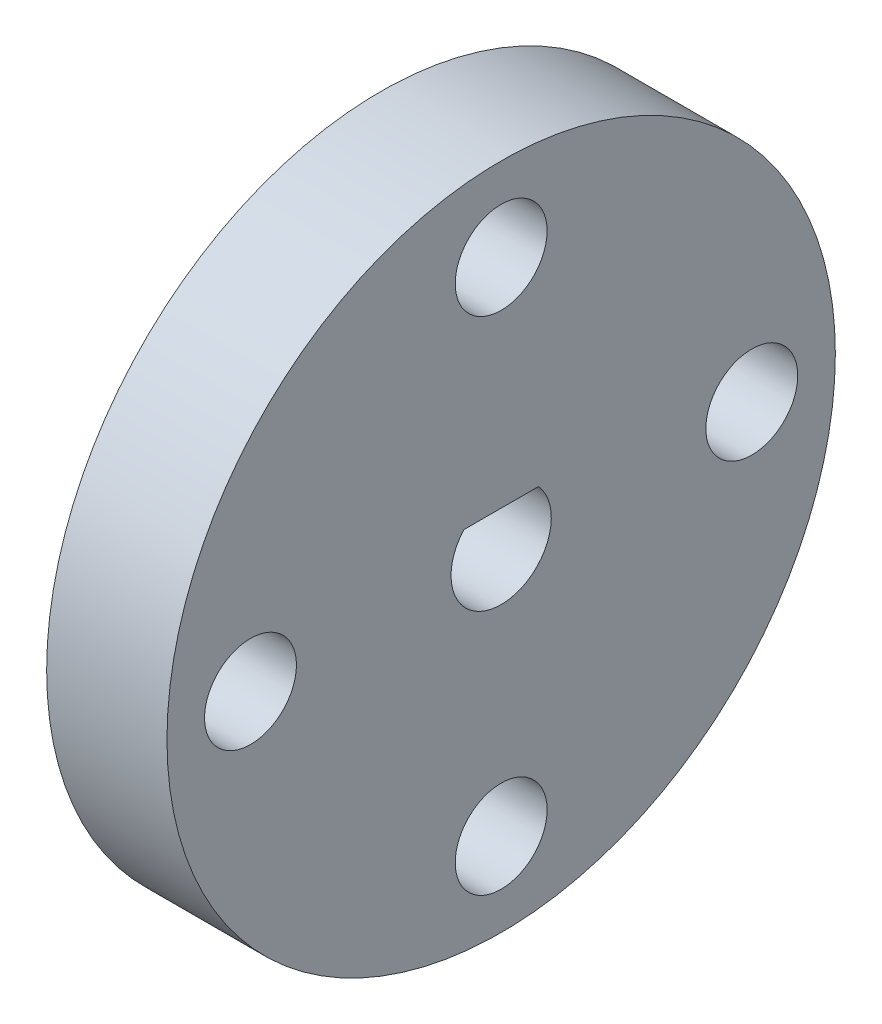
ISO-10303-21;
HEADER;
FILE_DESCRIPTION(('STEP AP214'),'2;1');
FILE_NAME('part.step','',(''),(''),'','','');
FILE_SCHEMA(('AUTOMOTIVE_DESIGN { 1 0 10303 214 1 1 1 1 }'));
ENDSEC;
DATA;
#1=APPLICATION_CONTEXT('core data for automotive mechanical design processes');
#2=APPLICATION_PROTOCOL_DEFINITION('international standard','automotive_design',2000,#1);
#3=PRODUCT_CONTEXT('',#1,'mechanical');
#4=PRODUCT('Part','Part','',(#3));
#5=PRODUCT_RELATED_PRODUCT_CATEGORY('part','',(#4));
#6=PRODUCT_DEFINITION_FORMATION('','',#4);
#7=PRODUCT_DEFINITION_CONTEXT('part definition',#1,'design');
#8=PRODUCT_DEFINITION('design','',#6,#7);
#9=PRODUCT_DEFINITION_SHAPE('','',#8);
#10=(LENGTH_UNIT() NAMED_UNIT(*) SI_UNIT(.MILLI.,.METRE.));
#11=(NAMED_UNIT(*) PLANE_ANGLE_UNIT() SI_UNIT($,.RADIAN.));
#12=(NAMED_UNIT(*) SI_UNIT($,.STERADIAN.) SOLID_ANGLE_UNIT());
#13=UNCERTAINTY_MEASURE_WITH_UNIT(LENGTH_MEASURE(1.E-05),#10,'distance_accuracy_value','');
#14=(GEOMETRIC_REPRESENTATION_CONTEXT(3) GLOBAL_UNCERTAINTY_ASSIGNED_CONTEXT((#13)) GLOBAL_UNIT_ASSIGNED_CONTEXT((#10,
#11,#12)) REPRESENTATION_CONTEXT('',''));
#15=CARTESIAN_POINT('',(0.,0.,0.));
#16=DIRECTION('',(0.,0.,1.));
#17=DIRECTION('',(1.,0.,0.));
#18=AXIS2_PLACEMENT_3D('',#15,#16,#17);
#19=CARTESIAN_POINT('',(7.2,0.,0.));
#20=DIRECTION('',(-1.,0.,0.));
#21=DIRECTION('',(0.,0.,1.));
#22=AXIS2_PLACEMENT_3D('',#19,#20,#21);
#23=PLANE('',#22);
#24=CARTESIAN_POINT('',(7.2,15.,0.));
#25=DIRECTION('',(1.,0.,0.));
#26=DIRECTION('',(0.,0.,-1.));
#27=AXIS2_PLACEMENT_3D('',#24,#25,#26);
#28=CIRCLE('',#27,2.74999999999999);
#29=CARTESIAN_POINT('',(7.2,15.,-2.74999999999999));
#30=VERTEX_POINT('',#29);
#31=EDGE_CURVE('E100',#30,#30,#28,.T.);
#32=ORIENTED_EDGE('',*,*,#31,.F.);
#33=EDGE_LOOP('',(#32));
#34=FACE_BOUND('',#33,.T.);
#35=CARTESIAN_POINT('',(7.2,0.,-15.));
#36=DIRECTION('',(1.,0.,0.));
#37=DIRECTION('',(0.,0.,-1.));
#38=AXIS2_PLACEMENT_3D('',#35,#36,#37);
#39=CIRCLE('',#38,2.74999999999999);
#40=CARTESIAN_POINT('',(7.2,0.,-17.75));
#41=VERTEX_POINT('',#40);
#42=EDGE_CURVE('E104',#41,#41,#39,.T.);
#43=ORIENTED_EDGE('',*,*,#42,.F.);
#44=EDGE_LOOP('',(#43));
#45=FACE_BOUND('',#44,.T.);
#46=CARTESIAN_POINT('',(7.2,-15.,0.));
#47=DIRECTION('',(1.,0.,0.));
#48=DIRECTION('',(0.,0.,-1.));
#49=AXIS2_PLACEMENT_3D('',#46,#47,#48);
#50=CIRCLE('',#49,2.74999999999999);
#51=CARTESIAN_POINT('',(7.2,-15.,-2.74999999999999));
#52=VERTEX_POINT('',#51);
#53=EDGE_CURVE('E108',#52,#52,#50,.T.);
#54=ORIENTED_EDGE('',*,*,#53,.F.);
#55=EDGE_LOOP('',(#54));
#56=FACE_BOUND('',#55,.T.);
#57=CARTESIAN_POINT('',(7.2,0.,15.));
#58=DIRECTION('',(1.,0.,0.));
#59=DIRECTION('',(0.,0.,-1.));
#60=AXIS2_PLACEMENT_3D('',#57,#58,#59);
#61=CIRCLE('',#60,2.74999999999999);
#62=CARTESIAN_POINT('',(7.2,0.,12.25));
#63=VERTEX_POINT('',#62);
#64=EDGE_CURVE('E78',#63,#63,#61,.T.);
#65=ORIENTED_EDGE('',*,*,#64,.F.);
#66=EDGE_LOOP('',(#65));
#67=FACE_BOUND('',#66,.T.);
#68=DIRECTION('',(0.,0.,1.));
#69=VECTOR('',#68,1.);
#70=CARTESIAN_POINT('',(7.2,2.,2.23606797749979));
#71=LINE('',#70,#69);
#72=CARTESIAN_POINT('',(7.2,2.,-2.23606797749979));
#73=VERTEX_POINT('',#72);
#74=CARTESIAN_POINT('',(7.2,2.,2.23606797749979));
#75=VERTEX_POINT('',#74);
#76=EDGE_CURVE('E70',#73,#75,#71,.T.);
#77=ORIENTED_EDGE('',*,*,#76,.F.);
#78=CARTESIAN_POINT('',(7.2,0.,0.));
#79=DIRECTION('',(1.,0.,0.));
#80=DIRECTION('',(0.,0.,-1.));
#81=AXIS2_PLACEMENT_3D('',#78,#79,#80);
#82=CIRCLE('',#81,3.);
#83=EDGE_CURVE('E51',#75,#73,#82,.T.);
#84=ORIENTED_EDGE('',*,*,#83,.F.);
#85=EDGE_LOOP('',(#77,#84));
#86=FACE_BOUND('',#85,.T.);
#87=CARTESIAN_POINT('',(7.2,0.,0.));
#88=DIRECTION('',(-1.,0.,0.));
#89=DIRECTION('',(0.,0.,1.));
#90=AXIS2_PLACEMENT_3D('',#87,#88,#89);
#91=CIRCLE('',#90,20.);
#92=CARTESIAN_POINT('',(7.2,0.,20.));
#93=VERTEX_POINT('',#92);
#94=EDGE_CURVE('E11',#93,#93,#91,.T.);
#95=ORIENTED_EDGE('',*,*,#94,.F.);
#96=EDGE_LOOP('',(#95));
#97=FACE_BOUND('',#96,.T.);
#98=ADVANCED_FACE('F37',(#34,#45,#56,#67,#86,#97),#23,.F.);
#99=CARTESIAN_POINT('',(-35.,0.,0.));
#100=DIRECTION('',(-1.,0.,0.));
#101=DIRECTION('',(0.,0.,1.));
#102=AXIS2_PLACEMENT_3D('',#99,#100,#101);
#103=CYLINDRICAL_SURFACE('',#102,20.);
#104=CARTESIAN_POINT('',(0.,0.,0.));
#105=DIRECTION('',(-1.,0.,0.));
#106=DIRECTION('',(0.,0.,1.));
#107=AXIS2_PLACEMENT_3D('',#104,#105,#106);
#108=CIRCLE('',#107,20.);
#109=CARTESIAN_POINT('',(0.,0.,20.));
#110=VERTEX_POINT('',#109);
#111=EDGE_CURVE('E44',#110,#110,#108,.T.);
#112=ORIENTED_EDGE('',*,*,#111,.F.);
#113=EDGE_LOOP('',(#112));
#114=FACE_BOUND('',#113,.T.);
#115=ORIENTED_EDGE('',*,*,#94,.T.);
#116=EDGE_LOOP('',(#115));
#117=FACE_BOUND('',#116,.T.);
#118=ADVANCED_FACE('F89',(#114,#117),#103,.T.);
#119=CARTESIAN_POINT('',(0.,0.,0.));
#120=DIRECTION('',(1.,0.,0.));
#121=DIRECTION('',(0.,0.,-1.));
#122=AXIS2_PLACEMENT_3D('',#119,#120,#121);
#123=PLANE('',#122);
#124=CARTESIAN_POINT('',(0.,15.,0.));
#125=DIRECTION('',(1.,0.,0.));
#126=DIRECTION('',(0.,0.,-1.));
#127=AXIS2_PLACEMENT_3D('',#124,#125,#126);
#128=CIRCLE('',#127,2.75);
#129=CARTESIAN_POINT('',(0.,15.,-2.75));
#130=VERTEX_POINT('',#129);
#131=EDGE_CURVE('E149',#130,#130,#128,.T.);
#132=ORIENTED_EDGE('',*,*,#131,.T.);
#133=EDGE_LOOP('',(#132));
#134=FACE_BOUND('',#133,.T.);
#135=CARTESIAN_POINT('',(0.,0.,-15.));
#136=DIRECTION('',(1.,0.,0.));
#137=DIRECTION('',(0.,0.,-1.));
#138=AXIS2_PLACEMENT_3D('',#135,#136,#137);
#139=CIRCLE('',#138,2.75);
#140=CARTESIAN_POINT('',(0.,0.,-17.75));
#141=VERTEX_POINT('',#140);
#142=EDGE_CURVE('E154',#141,#141,#139,.T.);
#143=ORIENTED_EDGE('',*,*,#142,.T.);
#144=EDGE_LOOP('',(#143));
#145=FACE_BOUND('',#144,.T.);
#146=CARTESIAN_POINT('',(0.,-15.,0.));
#147=DIRECTION('',(1.,0.,0.));
#148=DIRECTION('',(0.,0.,-1.));
#149=AXIS2_PLACEMENT_3D('',#146,#147,#148);
#150=CIRCLE('',#149,2.75);
#151=CARTESIAN_POINT('',(0.,-15.,-2.75));
#152=VERTEX_POINT('',#151);
#153=EDGE_CURVE('E112',#152,#152,#150,.T.);
#154=ORIENTED_EDGE('',*,*,#153,.T.);
#155=EDGE_LOOP('',(#154));
#156=FACE_BOUND('',#155,.T.);
#157=CARTESIAN_POINT('',(0.,0.,15.));
#158=DIRECTION('',(1.,0.,0.));
#159=DIRECTION('',(0.,0.,-1.));
#160=AXIS2_PLACEMENT_3D('',#157,#158,#159);
#161=CIRCLE('',#160,2.75);
#162=CARTESIAN_POINT('',(0.,0.,12.25));
#163=VERTEX_POINT('',#162);
#164=EDGE_CURVE('E75',#163,#163,#161,.T.);
#165=ORIENTED_EDGE('',*,*,#164,.T.);
#166=EDGE_LOOP('',(#165));
#167=FACE_BOUND('',#166,.T.);
#168=DIRECTION('',(0.,0.,1.));
#169=VECTOR('',#168,1.);
#170=CARTESIAN_POINT('',(0.,2.,2.23606797749979));
#171=LINE('',#170,#169);
#172=CARTESIAN_POINT('',(0.,2.,-2.23606797749979));
#173=VERTEX_POINT('',#172);
#174=CARTESIAN_POINT('',(0.,2.,2.23606797749979));
#175=VERTEX_POINT('',#174);
#176=EDGE_CURVE('E81',#173,#175,#171,.T.);
#177=ORIENTED_EDGE('',*,*,#176,.T.);
#178=CARTESIAN_POINT('',(0.,0.,0.));
#179=DIRECTION('',(1.,0.,0.));
#180=DIRECTION('',(0.,0.,-1.));
#181=AXIS2_PLACEMENT_3D('',#178,#179,#180);
#182=CIRCLE('',#181,3.);
#183=EDGE_CURVE('E56',#175,#173,#182,.T.);
#184=ORIENTED_EDGE('',*,*,#183,.T.);
#185=EDGE_LOOP('',(#177,#184));
#186=FACE_BOUND('',#185,.T.);
#187=ORIENTED_EDGE('',*,*,#111,.T.);
#188=EDGE_LOOP('',(#187));
#189=FACE_BOUND('',#188,.T.);
#190=ADVANCED_FACE('F87',(#134,#145,#156,#167,#186,#189),#123,.F.);
#191=CARTESIAN_POINT('',(0.,0.,0.));
#192=DIRECTION('',(1.,0.,0.));
#193=DIRECTION('',(0.,0.,-1.));
#194=AXIS2_PLACEMENT_3D('',#191,#192,#193);
#195=CYLINDRICAL_SURFACE('',#194,3.);
#196=ORIENTED_EDGE('',*,*,#83,.T.);
#197=DIRECTION('',(1.,0.,0.));
#198=VECTOR('',#197,1.);
#199=CARTESIAN_POINT('',(0.,2.,-2.23606797749979));
#200=LINE('',#199,#198);
#201=EDGE_CURVE('E67',#173,#73,#200,.T.);
#202=ORIENTED_EDGE('',*,*,#201,.F.);
#203=ORIENTED_EDGE('',*,*,#183,.F.);
#204=DIRECTION('',(1.,0.,0.));
#205=VECTOR('',#204,1.);
#206=CARTESIAN_POINT('',(0.,2.,2.23606797749979));
#207=LINE('',#206,#205);
#208=EDGE_CURVE('E61',#175,#75,#207,.T.);
#209=ORIENTED_EDGE('',*,*,#208,.T.);
#210=EDGE_LOOP('',(#196,#202,#203,#209));
#211=FACE_BOUND('',#210,.T.);
#212=ADVANCED_FACE('F63',(#211),#195,.F.);
#213=CARTESIAN_POINT('',(0.,2.,2.23606797749979));
#214=DIRECTION('',(0.,1.,0.));
#215=DIRECTION('',(0.,0.,1.));
#216=AXIS2_PLACEMENT_3D('',#213,#214,#215);
#217=PLANE('',#216);
#218=ORIENTED_EDGE('',*,*,#76,.T.);
#219=ORIENTED_EDGE('',*,*,#208,.F.);
#220=ORIENTED_EDGE('',*,*,#176,.F.);
#221=ORIENTED_EDGE('',*,*,#201,.T.);
#222=EDGE_LOOP('',(#218,#219,#220,#221));
#223=FACE_BOUND('',#222,.T.);
#224=ADVANCED_FACE('F71',(#223),#217,.F.);
#225=CARTESIAN_POINT('',(7.2,0.,15.));
#226=DIRECTION('',(1.,0.,0.));
#227=DIRECTION('',(0.,0.,-1.));
#228=AXIS2_PLACEMENT_3D('',#225,#226,#227);
#229=CYLINDRICAL_SURFACE('',#228,2.74999999999999);
#230=ORIENTED_EDGE('',*,*,#164,.F.);
#231=EDGE_LOOP('',(#230));
#232=FACE_BOUND('',#231,.T.);
#233=ORIENTED_EDGE('',*,*,#64,.T.);
#234=EDGE_LOOP('',(#233));
#235=FACE_BOUND('',#234,.T.);
#236=ADVANCED_FACE('F130',(#232,#235),#229,.F.);
#237=CARTESIAN_POINT('',(7.2,-15.,0.));
#238=DIRECTION('',(1.,0.,0.));
#239=DIRECTION('',(0.,0.,-1.));
#240=AXIS2_PLACEMENT_3D('',#237,#238,#239);
#241=CYLINDRICAL_SURFACE('',#240,2.74999999999999);
#242=ORIENTED_EDGE('',*,*,#153,.F.);
#243=EDGE_LOOP('',(#242));
#244=FACE_BOUND('',#243,.T.);
#245=ORIENTED_EDGE('',*,*,#53,.T.);
#246=EDGE_LOOP('',(#245));
#247=FACE_BOUND('',#246,.T.);
#248=ADVANCED_FACE('F133',(#244,#247),#241,.F.);
#249=CARTESIAN_POINT('',(7.2,0.,-15.));
#250=DIRECTION('',(1.,0.,0.));
#251=DIRECTION('',(0.,0.,-1.));
#252=AXIS2_PLACEMENT_3D('',#249,#250,#251);
#253=CYLINDRICAL_SURFACE('',#252,2.74999999999999);
#254=ORIENTED_EDGE('',*,*,#142,.F.);
#255=EDGE_LOOP('',(#254));
#256=FACE_BOUND('',#255,.T.);
#257=ORIENTED_EDGE('',*,*,#42,.T.);
#258=EDGE_LOOP('',(#257));
#259=FACE_BOUND('',#258,.T.);
#260=ADVANCED_FACE('F137',(#256,#259),#253,.F.);
#261=CARTESIAN_POINT('',(7.2,15.,0.));
#262=DIRECTION('',(1.,0.,0.));
#263=DIRECTION('',(0.,0.,-1.));
#264=AXIS2_PLACEMENT_3D('',#261,#262,#263);
#265=CYLINDRICAL_SURFACE('',#264,2.74999999999999);
#266=ORIENTED_EDGE('',*,*,#131,.F.);
#267=EDGE_LOOP('',(#266));
#268=FACE_BOUND('',#267,.T.);
#269=ORIENTED_EDGE('',*,*,#31,.T.);
#270=EDGE_LOOP('',(#269));
#271=FACE_BOUND('',#270,.T.);
#272=ADVANCED_FACE('F141',(#268,#271),#265,.F.);
#273=CLOSED_SHELL('',(#98,#118,#190,#212,#224,#236,#248,#260,#272));
#274=MANIFOLD_SOLID_BREP('B2',#273);
#275=ADVANCED_BREP_SHAPE_REPRESENTATION('',(#18,#274),#14);
#276=SHAPE_DEFINITION_REPRESENTATION(#9,#275);
ENDSEC;
END-ISO-10303-21;
